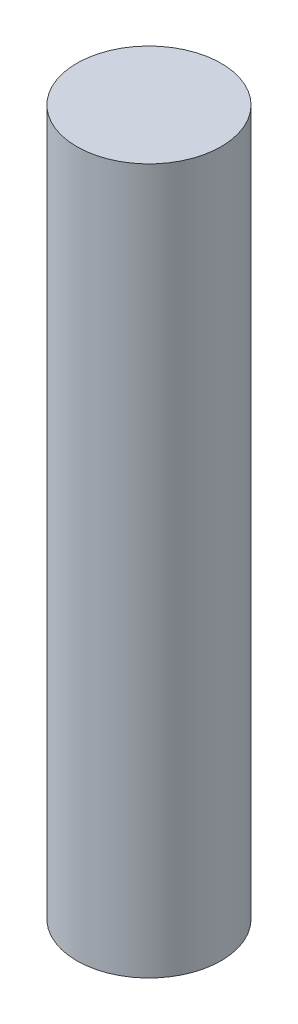
ISO-10303-21;
HEADER;
FILE_DESCRIPTION(('STEP AP214'),'2;1');
FILE_NAME('part.step','',(''),(''),'','','');
FILE_SCHEMA(('AUTOMOTIVE_DESIGN { 1 0 10303 214 1 1 1 1 }'));
ENDSEC;
DATA;
#1=APPLICATION_CONTEXT('core data for automotive mechanical design processes');
#2=APPLICATION_PROTOCOL_DEFINITION('international standard','automotive_design',2000,#1);
#3=PRODUCT_CONTEXT('',#1,'mechanical');
#4=PRODUCT('Part','Part','',(#3));
#5=PRODUCT_RELATED_PRODUCT_CATEGORY('part','',(#4));
#6=PRODUCT_DEFINITION_FORMATION('','',#4);
#7=PRODUCT_DEFINITION_CONTEXT('part definition',#1,'design');
#8=PRODUCT_DEFINITION('design','',#6,#7);
#9=PRODUCT_DEFINITION_SHAPE('','',#8);
#10=(LENGTH_UNIT() NAMED_UNIT(*) SI_UNIT(.MILLI.,.METRE.));
#11=(NAMED_UNIT(*) PLANE_ANGLE_UNIT() SI_UNIT($,.RADIAN.));
#12=(NAMED_UNIT(*) SI_UNIT($,.STERADIAN.) SOLID_ANGLE_UNIT());
#13=UNCERTAINTY_MEASURE_WITH_UNIT(LENGTH_MEASURE(1.E-05),#10,'distance_accuracy_value','');
#14=(GEOMETRIC_REPRESENTATION_CONTEXT(3) GLOBAL_UNCERTAINTY_ASSIGNED_CONTEXT((#13)) GLOBAL_UNIT_ASSIGNED_CONTEXT((#10,
#11,#12)) REPRESENTATION_CONTEXT('',''));
#15=CARTESIAN_POINT('',(0.,0.,0.));
#16=DIRECTION('',(0.,0.,1.));
#17=DIRECTION('',(1.,0.,0.));
#18=AXIS2_PLACEMENT_3D('',#15,#16,#17);
#19=CARTESIAN_POINT('',(0.,31.,0.));
#20=DIRECTION('',(0.,-1.,0.));
#21=DIRECTION('',(0.,0.,-1.));
#22=AXIS2_PLACEMENT_3D('',#19,#20,#21);
#23=CYLINDRICAL_SURFACE('',#22,3.175);
#24=CARTESIAN_POINT('',(0.,31.,0.));
#25=DIRECTION('',(0.,1.,0.));
#26=DIRECTION('',(0.,0.,1.));
#27=AXIS2_PLACEMENT_3D('',#24,#25,#26);
#28=CIRCLE('',#27,3.175);
#29=CARTESIAN_POINT('',(0.,31.,3.175));
#30=VERTEX_POINT('',#29);
#31=EDGE_CURVE('E10',#30,#30,#28,.T.);
#32=ORIENTED_EDGE('',*,*,#31,.F.);
#33=EDGE_LOOP('',(#32));
#34=FACE_BOUND('',#33,.T.);
#35=CARTESIAN_POINT('',(0.,0.,0.));
#36=DIRECTION('',(0.,1.,0.));
#37=DIRECTION('',(0.,0.,1.));
#38=AXIS2_PLACEMENT_3D('',#35,#36,#37);
#39=CIRCLE('',#38,3.175);
#40=CARTESIAN_POINT('',(0.,0.,3.175));
#41=VERTEX_POINT('',#40);
#42=EDGE_CURVE('E40',#41,#41,#39,.T.);
#43=ORIENTED_EDGE('',*,*,#42,.T.);
#44=EDGE_LOOP('',(#43));
#45=FACE_BOUND('',#44,.T.);
#46=ADVANCED_FACE('F37',(#34,#45),#23,.T.);
#47=CARTESIAN_POINT('',(0.,31.,0.));
#48=DIRECTION('',(0.,1.,0.));
#49=DIRECTION('',(0.,0.,1.));
#50=AXIS2_PLACEMENT_3D('',#47,#48,#49);
#51=PLANE('',#50);
#52=ORIENTED_EDGE('',*,*,#31,.T.);
#53=EDGE_LOOP('',(#52));
#54=FACE_BOUND('',#53,.T.);
#55=ADVANCED_FACE('F54',(#54),#51,.T.);
#56=CARTESIAN_POINT('',(0.,0.,0.));
#57=DIRECTION('',(0.,1.,0.));
#58=DIRECTION('',(0.,0.,1.));
#59=AXIS2_PLACEMENT_3D('',#56,#57,#58);
#60=PLANE('',#59);
#61=ORIENTED_EDGE('',*,*,#42,.F.);
#62=EDGE_LOOP('',(#61));
#63=FACE_BOUND('',#62,.T.);
#64=ADVANCED_FACE('F52',(#63),#60,.F.);
#65=CLOSED_SHELL('',(#46,#55,#64));
#66=MANIFOLD_SOLID_BREP('B2',#65);
#67=ADVANCED_BREP_SHAPE_REPRESENTATION('',(#18,#66),#14);
#68=SHAPE_DEFINITION_REPRESENTATION(#9,#67);
ENDSEC;
END-ISO-10303-21;
